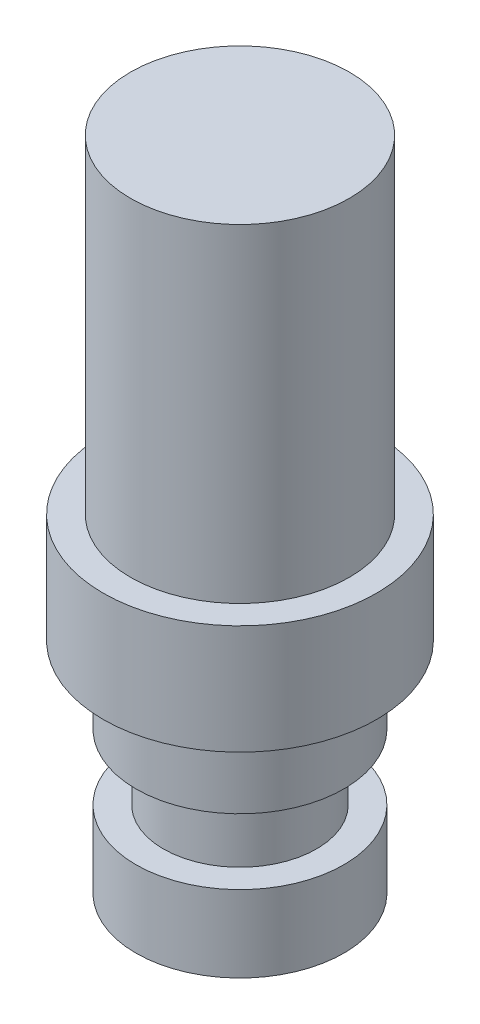
ISO-10303-21;
HEADER;
FILE_DESCRIPTION(('STEP AP214'),'2;1');
FILE_NAME('part.step','',(''),(''),'','','');
FILE_SCHEMA(('AUTOMOTIVE_DESIGN { 1 0 10303 214 1 1 1 1 }'));
ENDSEC;
DATA;
#1=APPLICATION_CONTEXT('core data for automotive mechanical design processes');
#2=APPLICATION_PROTOCOL_DEFINITION('international standard','automotive_design',2000,#1);
#3=PRODUCT_CONTEXT('',#1,'mechanical');
#4=PRODUCT('Part','Part','',(#3));
#5=PRODUCT_RELATED_PRODUCT_CATEGORY('part','',(#4));
#6=PRODUCT_DEFINITION_FORMATION('','',#4);
#7=PRODUCT_DEFINITION_CONTEXT('part definition',#1,'design');
#8=PRODUCT_DEFINITION('design','',#6,#7);
#9=PRODUCT_DEFINITION_SHAPE('','',#8);
#10=(LENGTH_UNIT() NAMED_UNIT(*) SI_UNIT(.MILLI.,.METRE.));
#11=(NAMED_UNIT(*) PLANE_ANGLE_UNIT() SI_UNIT($,.RADIAN.));
#12=(NAMED_UNIT(*) SI_UNIT($,.STERADIAN.) SOLID_ANGLE_UNIT());
#13=UNCERTAINTY_MEASURE_WITH_UNIT(LENGTH_MEASURE(1.E-05),#10,'distance_accuracy_value','');
#14=(GEOMETRIC_REPRESENTATION_CONTEXT(3) GLOBAL_UNCERTAINTY_ASSIGNED_CONTEXT((#13)) GLOBAL_UNIT_ASSIGNED_CONTEXT((#10,
#11,#12)) REPRESENTATION_CONTEXT('',''));
#15=CARTESIAN_POINT('',(0.,0.,0.));
#16=DIRECTION('',(0.,0.,1.));
#17=DIRECTION('',(1.,0.,0.));
#18=AXIS2_PLACEMENT_3D('',#15,#16,#17);
#19=CARTESIAN_POINT('',(0.,7.,0.));
#20=DIRECTION('',(0.,-1.,0.));
#21=DIRECTION('',(0.,0.,-1.));
#22=AXIS2_PLACEMENT_3D('',#19,#20,#21);
#23=CYLINDRICAL_SURFACE('',#22,9.5);
#24=CARTESIAN_POINT('',(0.,7.,0.));
#25=DIRECTION('',(0.,1.,0.));
#26=DIRECTION('',(0.,0.,1.));
#27=AXIS2_PLACEMENT_3D('',#24,#25,#26);
#28=CIRCLE('',#27,9.5);
#29=CARTESIAN_POINT('',(0.,7.,9.5));
#30=VERTEX_POINT('',#29);
#31=EDGE_CURVE('E46',#30,#30,#28,.T.);
#32=ORIENTED_EDGE('',*,*,#31,.F.);
#33=EDGE_LOOP('',(#32));
#34=FACE_BOUND('',#33,.T.);
#35=CARTESIAN_POINT('',(0.,0.,0.));
#36=DIRECTION('',(0.,1.,0.));
#37=DIRECTION('',(0.,0.,1.));
#38=AXIS2_PLACEMENT_3D('',#35,#36,#37);
#39=CIRCLE('',#38,9.5);
#40=CARTESIAN_POINT('',(0.,0.,9.5));
#41=VERTEX_POINT('',#40);
#42=EDGE_CURVE('E37',#41,#41,#39,.T.);
#43=ORIENTED_EDGE('',*,*,#42,.T.);
#44=EDGE_LOOP('',(#43));
#45=FACE_BOUND('',#44,.T.);
#46=ADVANCED_FACE('F34',(#34,#45),#23,.T.);
#47=CARTESIAN_POINT('',(0.,7.,0.));
#48=DIRECTION('',(0.,1.,0.));
#49=DIRECTION('',(0.,0.,1.));
#50=AXIS2_PLACEMENT_3D('',#47,#48,#49);
#51=PLANE('',#50);
#52=CARTESIAN_POINT('',(0.,7.,0.));
#53=DIRECTION('',(0.,1.,0.));
#54=DIRECTION('',(0.,0.,1.));
#55=AXIS2_PLACEMENT_3D('',#52,#53,#54);
#56=CIRCLE('',#55,7.);
#57=CARTESIAN_POINT('',(0.,7.,7.));
#58=VERTEX_POINT('',#57);
#59=EDGE_CURVE('E41',#58,#58,#56,.T.);
#60=ORIENTED_EDGE('',*,*,#59,.F.);
#61=EDGE_LOOP('',(#60));
#62=FACE_BOUND('',#61,.T.);
#63=ORIENTED_EDGE('',*,*,#31,.T.);
#64=EDGE_LOOP('',(#63));
#65=FACE_BOUND('',#64,.T.);
#66=ADVANCED_FACE('F75',(#62,#65),#51,.T.);
#67=CARTESIAN_POINT('',(0.,0.,0.));
#68=DIRECTION('',(0.,1.,0.));
#69=DIRECTION('',(0.,0.,1.));
#70=AXIS2_PLACEMENT_3D('',#67,#68,#69);
#71=PLANE('',#70);
#72=ORIENTED_EDGE('',*,*,#42,.F.);
#73=EDGE_LOOP('',(#72));
#74=FACE_BOUND('',#73,.T.);
#75=ADVANCED_FACE('F72',(#74),#71,.F.);
#76=CARTESIAN_POINT('',(0.,13.,0.));
#77=DIRECTION('',(0.,-1.,0.));
#78=DIRECTION('',(0.,0.,-1.));
#79=AXIS2_PLACEMENT_3D('',#76,#77,#78);
#80=CYLINDRICAL_SURFACE('',#79,7.);
#81=CARTESIAN_POINT('',(0.,13.,0.));
#82=DIRECTION('',(0.,1.,0.));
#83=DIRECTION('',(0.,0.,1.));
#84=AXIS2_PLACEMENT_3D('',#81,#82,#83);
#85=CIRCLE('',#84,7.);
#86=CARTESIAN_POINT('',(0.,13.,7.));
#87=VERTEX_POINT('',#86);
#88=EDGE_CURVE('E61',#87,#87,#85,.T.);
#89=ORIENTED_EDGE('',*,*,#88,.F.);
#90=EDGE_LOOP('',(#89));
#91=FACE_BOUND('',#90,.T.);
#92=ORIENTED_EDGE('',*,*,#59,.T.);
#93=EDGE_LOOP('',(#92));
#94=FACE_BOUND('',#93,.T.);
#95=ADVANCED_FACE('F74',(#91,#94),#80,.T.);
#96=CARTESIAN_POINT('',(0.,20.,0.));
#97=DIRECTION('',(0.,-1.,0.));
#98=DIRECTION('',(0.,0.,-1.));
#99=AXIS2_PLACEMENT_3D('',#96,#97,#98);
#100=CYLINDRICAL_SURFACE('',#99,9.5);
#101=CARTESIAN_POINT('',(0.,20.,0.));
#102=DIRECTION('',(0.,1.,0.));
#103=DIRECTION('',(0.,0.,1.));
#104=AXIS2_PLACEMENT_3D('',#101,#102,#103);
#105=CIRCLE('',#104,9.5);
#106=CARTESIAN_POINT('',(0.,20.,9.5));
#107=VERTEX_POINT('',#106);
#108=EDGE_CURVE('E58',#107,#107,#105,.T.);
#109=ORIENTED_EDGE('',*,*,#108,.F.);
#110=EDGE_LOOP('',(#109));
#111=FACE_BOUND('',#110,.T.);
#112=CARTESIAN_POINT('',(0.,13.,0.));
#113=DIRECTION('',(0.,1.,0.));
#114=DIRECTION('',(0.,0.,1.));
#115=AXIS2_PLACEMENT_3D('',#112,#113,#114);
#116=CIRCLE('',#115,9.5);
#117=CARTESIAN_POINT('',(0.,13.,9.5));
#118=VERTEX_POINT('',#117);
#119=EDGE_CURVE('E54',#118,#118,#116,.T.);
#120=ORIENTED_EDGE('',*,*,#119,.T.);
#121=EDGE_LOOP('',(#120));
#122=FACE_BOUND('',#121,.T.);
#123=ADVANCED_FACE('F80',(#111,#122),#100,.T.);
#124=CARTESIAN_POINT('',(0.,13.,0.));
#125=DIRECTION('',(0.,1.,0.));
#126=DIRECTION('',(0.,0.,1.));
#127=AXIS2_PLACEMENT_3D('',#124,#125,#126);
#128=PLANE('',#127);
#129=ORIENTED_EDGE('',*,*,#88,.T.);
#130=EDGE_LOOP('',(#129));
#131=FACE_BOUND('',#130,.T.);
#132=ORIENTED_EDGE('',*,*,#119,.F.);
#133=EDGE_LOOP('',(#132));
#134=FACE_BOUND('',#133,.T.);
#135=ADVANCED_FACE('F110',(#131,#134),#128,.F.);
#136=CARTESIAN_POINT('',(0.,30.,0.));
#137=DIRECTION('',(0.,-1.,0.));
#138=DIRECTION('',(0.,0.,-1.));
#139=AXIS2_PLACEMENT_3D('',#136,#137,#138);
#140=CYLINDRICAL_SURFACE('',#139,12.5);
#141=CARTESIAN_POINT('',(0.,30.,0.));
#142=DIRECTION('',(0.,1.,0.));
#143=DIRECTION('',(0.,0.,1.));
#144=AXIS2_PLACEMENT_3D('',#141,#142,#143);
#145=CIRCLE('',#144,12.5);
#146=CARTESIAN_POINT('',(0.,30.,12.5));
#147=VERTEX_POINT('',#146);
#148=EDGE_CURVE('E51',#147,#147,#145,.T.);
#149=ORIENTED_EDGE('',*,*,#148,.F.);
#150=EDGE_LOOP('',(#149));
#151=FACE_BOUND('',#150,.T.);
#152=CARTESIAN_POINT('',(0.,20.,0.));
#153=DIRECTION('',(0.,1.,0.));
#154=DIRECTION('',(0.,0.,1.));
#155=AXIS2_PLACEMENT_3D('',#152,#153,#154);
#156=CIRCLE('',#155,12.5);
#157=CARTESIAN_POINT('',(0.,20.,12.5));
#158=VERTEX_POINT('',#157);
#159=EDGE_CURVE('E55',#158,#158,#156,.T.);
#160=ORIENTED_EDGE('',*,*,#159,.T.);
#161=EDGE_LOOP('',(#160));
#162=FACE_BOUND('',#161,.T.);
#163=ADVANCED_FACE('F120',(#151,#162),#140,.T.);
#164=CARTESIAN_POINT('',(0.,30.,0.));
#165=DIRECTION('',(0.,1.,0.));
#166=DIRECTION('',(0.,0.,1.));
#167=AXIS2_PLACEMENT_3D('',#164,#165,#166);
#168=PLANE('',#167);
#169=CARTESIAN_POINT('',(0.,30.,0.));
#170=DIRECTION('',(0.,1.,0.));
#171=DIRECTION('',(0.,0.,1.));
#172=AXIS2_PLACEMENT_3D('',#169,#170,#171);
#173=CIRCLE('',#172,10.);
#174=CARTESIAN_POINT('',(0.,30.,10.));
#175=VERTEX_POINT('',#174);
#176=EDGE_CURVE('E10',#175,#175,#173,.T.);
#177=ORIENTED_EDGE('',*,*,#176,.F.);
#178=EDGE_LOOP('',(#177));
#179=FACE_BOUND('',#178,.T.);
#180=ORIENTED_EDGE('',*,*,#148,.T.);
#181=EDGE_LOOP('',(#180));
#182=FACE_BOUND('',#181,.T.);
#183=ADVANCED_FACE('F130',(#179,#182),#168,.T.);
#184=CARTESIAN_POINT('',(0.,20.,0.));
#185=DIRECTION('',(0.,1.,0.));
#186=DIRECTION('',(0.,0.,1.));
#187=AXIS2_PLACEMENT_3D('',#184,#185,#186);
#188=PLANE('',#187);
#189=ORIENTED_EDGE('',*,*,#108,.T.);
#190=EDGE_LOOP('',(#189));
#191=FACE_BOUND('',#190,.T.);
#192=ORIENTED_EDGE('',*,*,#159,.F.);
#193=EDGE_LOOP('',(#192));
#194=FACE_BOUND('',#193,.T.);
#195=ADVANCED_FACE('F138',(#191,#194),#188,.F.);
#196=CARTESIAN_POINT('',(0.,60.,0.));
#197=DIRECTION('',(0.,-1.,0.));
#198=DIRECTION('',(0.,0.,-1.));
#199=AXIS2_PLACEMENT_3D('',#196,#197,#198);
#200=CYLINDRICAL_SURFACE('',#199,10.);
#201=CARTESIAN_POINT('',(0.,60.,0.));
#202=DIRECTION('',(0.,1.,0.));
#203=DIRECTION('',(0.,0.,1.));
#204=AXIS2_PLACEMENT_3D('',#201,#202,#203);
#205=CIRCLE('',#204,10.);
#206=CARTESIAN_POINT('',(0.,60.,10.));
#207=VERTEX_POINT('',#206);
#208=EDGE_CURVE('E50',#207,#207,#205,.T.);
#209=ORIENTED_EDGE('',*,*,#208,.F.);
#210=EDGE_LOOP('',(#209));
#211=FACE_BOUND('',#210,.T.);
#212=ORIENTED_EDGE('',*,*,#176,.T.);
#213=EDGE_LOOP('',(#212));
#214=FACE_BOUND('',#213,.T.);
#215=ADVANCED_FACE('F143',(#211,#214),#200,.T.);
#216=CARTESIAN_POINT('',(0.,60.,0.));
#217=DIRECTION('',(0.,1.,0.));
#218=DIRECTION('',(0.,0.,1.));
#219=AXIS2_PLACEMENT_3D('',#216,#217,#218);
#220=PLANE('',#219);
#221=ORIENTED_EDGE('',*,*,#208,.T.);
#222=EDGE_LOOP('',(#221));
#223=FACE_BOUND('',#222,.T.);
#224=ADVANCED_FACE('F160',(#223),#220,.T.);
#225=CLOSED_SHELL('',(#46,#66,#75,#95,#123,#135,#163,#183,#195,#215,#224));
#226=MANIFOLD_SOLID_BREP('B2',#225);
#227=ADVANCED_BREP_SHAPE_REPRESENTATION('',(#18,#226),#14);
#228=SHAPE_DEFINITION_REPRESENTATION(#9,#227);
ENDSEC;
END-ISO-10303-21;
